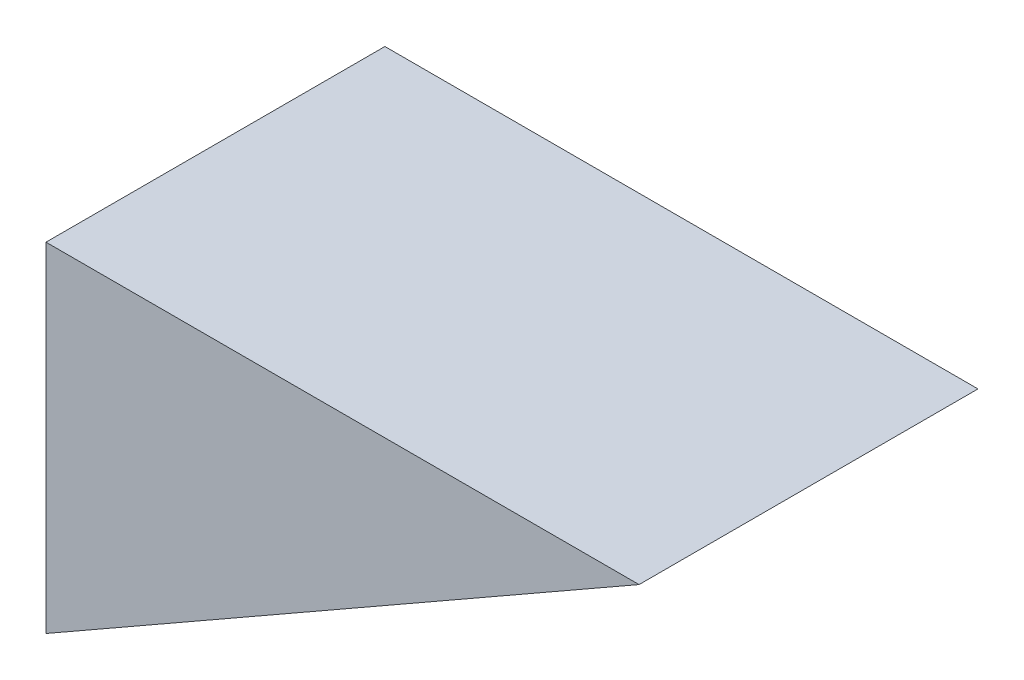
ISO-10303-21;
HEADER;
FILE_DESCRIPTION(('STEP AP214'),'2;1');
FILE_NAME('part.step','',(''),(''),'','','');
FILE_SCHEMA(('AUTOMOTIVE_DESIGN { 1 0 10303 214 1 1 1 1 }'));
ENDSEC;
DATA;
#1=APPLICATION_CONTEXT('core data for automotive mechanical design processes');
#2=APPLICATION_PROTOCOL_DEFINITION('international standard','automotive_design',2000,#1);
#3=PRODUCT_CONTEXT('',#1,'mechanical');
#4=PRODUCT('Part','Part','',(#3));
#5=PRODUCT_RELATED_PRODUCT_CATEGORY('part','',(#4));
#6=PRODUCT_DEFINITION_FORMATION('','',#4);
#7=PRODUCT_DEFINITION_CONTEXT('part definition',#1,'design');
#8=PRODUCT_DEFINITION('design','',#6,#7);
#9=PRODUCT_DEFINITION_SHAPE('','',#8);
#10=(LENGTH_UNIT() NAMED_UNIT(*) SI_UNIT(.MILLI.,.METRE.));
#11=(NAMED_UNIT(*) PLANE_ANGLE_UNIT() SI_UNIT($,.RADIAN.));
#12=(NAMED_UNIT(*) SI_UNIT($,.STERADIAN.) SOLID_ANGLE_UNIT());
#13=UNCERTAINTY_MEASURE_WITH_UNIT(LENGTH_MEASURE(1.E-05),#10,'distance_accuracy_value','');
#14=(GEOMETRIC_REPRESENTATION_CONTEXT(3) GLOBAL_UNCERTAINTY_ASSIGNED_CONTEXT((#13)) GLOBAL_UNIT_ASSIGNED_CONTEXT((#10,
#11,#12)) REPRESENTATION_CONTEXT('',''));
#15=CARTESIAN_POINT('',(0.,0.,0.));
#16=DIRECTION('',(0.,0.,1.));
#17=DIRECTION('',(1.,0.,0.));
#18=AXIS2_PLACEMENT_3D('',#15,#16,#17);
#19=CARTESIAN_POINT('',(0.,0.,20.));
#20=DIRECTION('',(-0.496138938356834,0.868243142124459,0.));
#21=DIRECTION('',(-0.868243142124459,-0.496138938356834,0.));
#22=AXIS2_PLACEMENT_3D('',#19,#20,#21);
#23=PLANE('',#22);
#24=DIRECTION('',(0.,0.,-1.));
#25=VECTOR('',#24,1.);
#26=CARTESIAN_POINT('',(0.,0.,20.));
#27=LINE('',#26,#25);
#28=CARTESIAN_POINT('',(0.,0.,20.));
#29=VERTEX_POINT('',#28);
#30=CARTESIAN_POINT('',(0.,0.,18.0048199754425));
#31=VERTEX_POINT('',#30);
#32=EDGE_CURVE('E144',#29,#31,#27,.T.);
#33=ORIENTED_EDGE('',*,*,#32,.T.);
#34=DIRECTION('',(0.868243142124459,0.496138938356834,0.));
#35=VECTOR('',#34,1.);
#36=CARTESIAN_POINT('',(0.,0.,18.0048199754425));
#37=LINE('',#36,#35);
#38=CARTESIAN_POINT('',(15.,8.57142857142857,18.0048199754425));
#39=VERTEX_POINT('',#38);
#40=EDGE_CURVE('E132',#31,#39,#37,.T.);
#41=ORIENTED_EDGE('',*,*,#40,.T.);
#42=DIRECTION('',(0.,0.,1.));
#43=VECTOR('',#42,1.);
#44=CARTESIAN_POINT('',(15.,8.57142857142857,20.));
#45=LINE('',#44,#43);
#46=CARTESIAN_POINT('',(15.,8.57142857142857,2.02307138335692));
#47=VERTEX_POINT('',#46);
#48=EDGE_CURVE('E11',#47,#39,#45,.T.);
#49=ORIENTED_EDGE('',*,*,#48,.F.);
#50=DIRECTION('',(0.868243142124459,0.496138938356834,0.));
#51=VECTOR('',#50,1.);
#52=CARTESIAN_POINT('',(0.,0.,2.02307138335692));
#53=LINE('',#52,#51);
#54=CARTESIAN_POINT('',(0.,0.,2.02307138335692));
#55=VERTEX_POINT('',#54);
#56=EDGE_CURVE('E129',#55,#47,#53,.T.);
#57=ORIENTED_EDGE('',*,*,#56,.F.);
#58=CARTESIAN_POINT('',(0.,0.,0.));
#59=VERTEX_POINT('',#58);
#60=EDGE_CURVE('E74',#55,#59,#27,.T.);
#61=ORIENTED_EDGE('',*,*,#60,.T.);
#62=DIRECTION('',(0.868243142124459,0.496138938356834,0.));
#63=VECTOR('',#62,1.);
#64=CARTESIAN_POINT('',(0.,0.,0.));
#65=LINE('',#64,#63);
#66=CARTESIAN_POINT('',(35.,20.,0.));
#67=VERTEX_POINT('',#66);
#68=EDGE_CURVE('E134',#59,#67,#65,.T.);
#69=ORIENTED_EDGE('',*,*,#68,.T.);
#70=DIRECTION('',(0.,0.,-1.));
#71=VECTOR('',#70,1.);
#72=CARTESIAN_POINT('',(35.,20.,20.));
#73=LINE('',#72,#71);
#74=CARTESIAN_POINT('',(35.,20.,20.));
#75=VERTEX_POINT('',#74);
#76=EDGE_CURVE('E40',#75,#67,#73,.T.);
#77=ORIENTED_EDGE('',*,*,#76,.F.);
#78=DIRECTION('',(0.868243142124459,0.496138938356834,0.));
#79=VECTOR('',#78,1.);
#80=CARTESIAN_POINT('',(0.,0.,20.));
#81=LINE('',#80,#79);
#82=EDGE_CURVE('E135',#29,#75,#81,.T.);
#83=ORIENTED_EDGE('',*,*,#82,.F.);
#84=EDGE_LOOP('',(#33,#41,#49,#57,#61,#69,#77,#83));
#85=FACE_BOUND('',#84,.T.);
#86=ADVANCED_FACE('F33',(#85),#23,.F.);
#87=CARTESIAN_POINT('',(0.,20.,20.));
#88=DIRECTION('',(0.,-1.,0.));
#89=DIRECTION('',(0.,0.,-1.));
#90=AXIS2_PLACEMENT_3D('',#87,#88,#89);
#91=PLANE('',#90);
#92=DIRECTION('',(-1.,0.,0.));
#93=VECTOR('',#92,1.);
#94=CARTESIAN_POINT('',(0.,20.,0.));
#95=LINE('',#94,#93);
#96=CARTESIAN_POINT('',(0.,20.,0.));
#97=VERTEX_POINT('',#96);
#98=EDGE_CURVE('E141',#67,#97,#95,.T.);
#99=ORIENTED_EDGE('',*,*,#98,.T.);
#100=DIRECTION('',(0.,0.,-1.));
#101=VECTOR('',#100,1.);
#102=CARTESIAN_POINT('',(0.,20.,20.));
#103=LINE('',#102,#101);
#104=CARTESIAN_POINT('',(0.,20.,20.));
#105=VERTEX_POINT('',#104);
#106=EDGE_CURVE('E147',#105,#97,#103,.T.);
#107=ORIENTED_EDGE('',*,*,#106,.F.);
#108=DIRECTION('',(-1.,0.,0.));
#109=VECTOR('',#108,1.);
#110=CARTESIAN_POINT('',(0.,20.,20.));
#111=LINE('',#110,#109);
#112=EDGE_CURVE('E80',#75,#105,#111,.T.);
#113=ORIENTED_EDGE('',*,*,#112,.F.);
#114=ORIENTED_EDGE('',*,*,#76,.T.);
#115=EDGE_LOOP('',(#99,#107,#113,#114));
#116=FACE_BOUND('',#115,.T.);
#117=ADVANCED_FACE('F150',(#116),#91,.F.);
#118=CARTESIAN_POINT('',(0.,0.,20.));
#119=DIRECTION('',(1.,0.,0.));
#120=DIRECTION('',(0.,0.,-1.));
#121=AXIS2_PLACEMENT_3D('',#118,#119,#120);
#122=PLANE('',#121);
#123=DIRECTION('',(0.,0.,-1.));
#124=VECTOR('',#123,1.);
#125=CARTESIAN_POINT('',(0.,17.9908742960429,0.));
#126=LINE('',#125,#124);
#127=CARTESIAN_POINT('',(0.,17.9908742960429,18.0048199754425));
#128=VERTEX_POINT('',#127);
#129=CARTESIAN_POINT('',(0.,17.9908742960429,2.02307138335692));
#130=VERTEX_POINT('',#129);
#131=EDGE_CURVE('E125',#128,#130,#126,.T.);
#132=ORIENTED_EDGE('',*,*,#131,.F.);
#133=DIRECTION('',(0.,1.,0.));
#134=VECTOR('',#133,1.);
#135=CARTESIAN_POINT('',(0.,0.,18.0048199754425));
#136=LINE('',#135,#134);
#137=EDGE_CURVE('E47',#31,#128,#136,.T.);
#138=ORIENTED_EDGE('',*,*,#137,.F.);
#139=ORIENTED_EDGE('',*,*,#32,.F.);
#140=DIRECTION('',(0.,-1.,0.));
#141=VECTOR('',#140,1.);
#142=CARTESIAN_POINT('',(0.,0.,20.));
#143=LINE('',#142,#141);
#144=EDGE_CURVE('E56',#105,#29,#143,.T.);
#145=ORIENTED_EDGE('',*,*,#144,.F.);
#146=ORIENTED_EDGE('',*,*,#106,.T.);
#147=DIRECTION('',(0.,-1.,0.));
#148=VECTOR('',#147,1.);
#149=CARTESIAN_POINT('',(0.,0.,0.));
#150=LINE('',#149,#148);
#151=EDGE_CURVE('E137',#97,#59,#150,.T.);
#152=ORIENTED_EDGE('',*,*,#151,.T.);
#153=ORIENTED_EDGE('',*,*,#60,.F.);
#154=DIRECTION('',(0.,1.,0.));
#155=VECTOR('',#154,1.);
#156=CARTESIAN_POINT('',(0.,0.,2.02307138335692));
#157=LINE('',#156,#155);
#158=EDGE_CURVE('E109',#55,#130,#157,.T.);
#159=ORIENTED_EDGE('',*,*,#158,.T.);
#160=EDGE_LOOP('',(#132,#138,#139,#145,#146,#152,#153,#159));
#161=FACE_BOUND('',#160,.T.);
#162=ADVANCED_FACE('F157',(#161),#122,.F.);
#163=CARTESIAN_POINT('',(0.,0.,20.));
#164=DIRECTION('',(0.,0.,1.));
#165=DIRECTION('',(1.,0.,0.));
#166=AXIS2_PLACEMENT_3D('',#163,#164,#165);
#167=PLANE('',#166);
#168=ORIENTED_EDGE('',*,*,#82,.T.);
#169=ORIENTED_EDGE('',*,*,#112,.T.);
#170=ORIENTED_EDGE('',*,*,#144,.T.);
#171=EDGE_LOOP('',(#168,#169,#170));
#172=FACE_BOUND('',#171,.T.);
#173=ADVANCED_FACE('F158',(#172),#167,.T.);
#174=CARTESIAN_POINT('',(0.,0.,0.));
#175=DIRECTION('',(0.,0.,1.));
#176=DIRECTION('',(1.,0.,0.));
#177=AXIS2_PLACEMENT_3D('',#174,#175,#176);
#178=PLANE('',#177);
#179=ORIENTED_EDGE('',*,*,#68,.F.);
#180=ORIENTED_EDGE('',*,*,#151,.F.);
#181=ORIENTED_EDGE('',*,*,#98,.F.);
#182=EDGE_LOOP('',(#179,#180,#181));
#183=FACE_BOUND('',#182,.T.);
#184=ADVANCED_FACE('F155',(#183),#178,.F.);
#185=CARTESIAN_POINT('',(15.,0.,0.));
#186=DIRECTION('',(-1.,0.,0.));
#187=DIRECTION('',(0.,0.,1.));
#188=AXIS2_PLACEMENT_3D('',#185,#186,#187);
#189=PLANE('',#188);
#190=ORIENTED_EDGE('',*,*,#48,.T.);
#191=DIRECTION('',(0.,1.,0.));
#192=VECTOR('',#191,1.);
#193=CARTESIAN_POINT('',(15.,0.,18.0048199754425));
#194=LINE('',#193,#192);
#195=CARTESIAN_POINT('',(15.,17.9908742960429,18.0048199754425));
#196=VERTEX_POINT('',#195);
#197=EDGE_CURVE('E102',#39,#196,#194,.T.);
#198=ORIENTED_EDGE('',*,*,#197,.T.);
#199=DIRECTION('',(0.,0.,-1.));
#200=VECTOR('',#199,1.);
#201=CARTESIAN_POINT('',(15.,17.9908742960429,0.));
#202=LINE('',#201,#200);
#203=CARTESIAN_POINT('',(15.,17.9908742960429,2.02307138335692));
#204=VERTEX_POINT('',#203);
#205=EDGE_CURVE('E106',#196,#204,#202,.T.);
#206=ORIENTED_EDGE('',*,*,#205,.T.);
#207=DIRECTION('',(0.,1.,0.));
#208=VECTOR('',#207,1.);
#209=CARTESIAN_POINT('',(15.,0.,2.02307138335692));
#210=LINE('',#209,#208);
#211=EDGE_CURVE('E117',#47,#204,#210,.T.);
#212=ORIENTED_EDGE('',*,*,#211,.F.);
#213=EDGE_LOOP('',(#190,#198,#206,#212));
#214=FACE_BOUND('',#213,.T.);
#215=ADVANCED_FACE('F103',(#214),#189,.T.);
#216=CARTESIAN_POINT('',(15.,0.,18.0048199754425));
#217=DIRECTION('',(0.,0.,1.));
#218=DIRECTION('',(1.,0.,0.));
#219=AXIS2_PLACEMENT_3D('',#216,#217,#218);
#220=PLANE('',#219);
#221=ORIENTED_EDGE('',*,*,#137,.T.);
#222=DIRECTION('',(-1.,0.,0.));
#223=VECTOR('',#222,1.);
#224=CARTESIAN_POINT('',(15.,17.9908742960429,18.0048199754425));
#225=LINE('',#224,#223);
#226=EDGE_CURVE('E111',#196,#128,#225,.T.);
#227=ORIENTED_EDGE('',*,*,#226,.F.);
#228=ORIENTED_EDGE('',*,*,#197,.F.);
#229=ORIENTED_EDGE('',*,*,#40,.F.);
#230=EDGE_LOOP('',(#221,#227,#228,#229));
#231=FACE_BOUND('',#230,.T.);
#232=ADVANCED_FACE('F112',(#231),#220,.F.);
#233=CARTESIAN_POINT('',(15.,0.,2.02307138335692));
#234=DIRECTION('',(0.,0.,1.));
#235=DIRECTION('',(1.,0.,0.));
#236=AXIS2_PLACEMENT_3D('',#233,#234,#235);
#237=PLANE('',#236);
#238=ORIENTED_EDGE('',*,*,#56,.T.);
#239=ORIENTED_EDGE('',*,*,#211,.T.);
#240=DIRECTION('',(-1.,0.,0.));
#241=VECTOR('',#240,1.);
#242=CARTESIAN_POINT('',(15.,17.9908742960429,2.02307138335692));
#243=LINE('',#242,#241);
#244=EDGE_CURVE('E116',#204,#130,#243,.T.);
#245=ORIENTED_EDGE('',*,*,#244,.T.);
#246=ORIENTED_EDGE('',*,*,#158,.F.);
#247=EDGE_LOOP('',(#238,#239,#245,#246));
#248=FACE_BOUND('',#247,.T.);
#249=ADVANCED_FACE('F200',(#248),#237,.T.);
#250=CARTESIAN_POINT('',(15.,17.9908742960429,0.));
#251=DIRECTION('',(0.,1.,0.));
#252=DIRECTION('',(0.,0.,1.));
#253=AXIS2_PLACEMENT_3D('',#250,#251,#252);
#254=PLANE('',#253);
#255=ORIENTED_EDGE('',*,*,#131,.T.);
#256=ORIENTED_EDGE('',*,*,#244,.F.);
#257=ORIENTED_EDGE('',*,*,#205,.F.);
#258=ORIENTED_EDGE('',*,*,#226,.T.);
#259=EDGE_LOOP('',(#255,#256,#257,#258));
#260=FACE_BOUND('',#259,.T.);
#261=ADVANCED_FACE('F120',(#260),#254,.F.);
#262=CLOSED_SHELL('',(#86,#117,#162,#173,#184,#215,#232,#249,#261));
#263=MANIFOLD_SOLID_BREP('B2',#262);
#264=ADVANCED_BREP_SHAPE_REPRESENTATION('',(#18,#263),#14);
#265=SHAPE_DEFINITION_REPRESENTATION(#9,#264);
ENDSEC;
END-ISO-10303-21;
